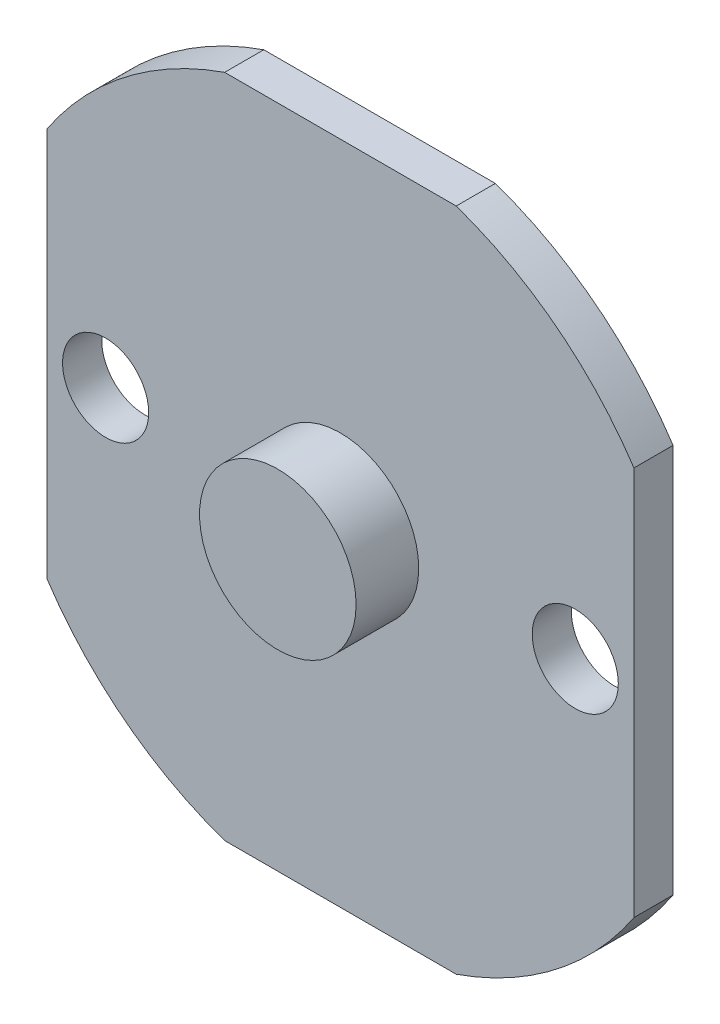
ISO-10303-21;
HEADER;
FILE_DESCRIPTION(('STEP AP214'),'2;1');
FILE_NAME('part.step','',(''),(''),'','','');
FILE_SCHEMA(('AUTOMOTIVE_DESIGN { 1 0 10303 214 1 1 1 1 }'));
ENDSEC;
DATA;
#1=APPLICATION_CONTEXT('core data for automotive mechanical design processes');
#2=APPLICATION_PROTOCOL_DEFINITION('international standard','automotive_design',2000,#1);
#3=PRODUCT_CONTEXT('',#1,'mechanical');
#4=PRODUCT('Part','Part','',(#3));
#5=PRODUCT_RELATED_PRODUCT_CATEGORY('part','',(#4));
#6=PRODUCT_DEFINITION_FORMATION('','',#4);
#7=PRODUCT_DEFINITION_CONTEXT('part definition',#1,'design');
#8=PRODUCT_DEFINITION('design','',#6,#7);
#9=PRODUCT_DEFINITION_SHAPE('','',#8);
#10=(LENGTH_UNIT() NAMED_UNIT(*) SI_UNIT(.MILLI.,.METRE.));
#11=(NAMED_UNIT(*) PLANE_ANGLE_UNIT() SI_UNIT($,.RADIAN.));
#12=(NAMED_UNIT(*) SI_UNIT($,.STERADIAN.) SOLID_ANGLE_UNIT());
#13=UNCERTAINTY_MEASURE_WITH_UNIT(LENGTH_MEASURE(1.E-05),#10,'distance_accuracy_value','');
#14=(GEOMETRIC_REPRESENTATION_CONTEXT(3) GLOBAL_UNCERTAINTY_ASSIGNED_CONTEXT((#13)) GLOBAL_UNIT_ASSIGNED_CONTEXT((#10,
#11,#12)) REPRESENTATION_CONTEXT('',''));
#15=CARTESIAN_POINT('',(0.,0.,0.));
#16=DIRECTION('',(0.,0.,1.));
#17=DIRECTION('',(1.,0.,0.));
#18=AXIS2_PLACEMENT_3D('',#15,#16,#17);
#19=CARTESIAN_POINT('',(0.,0.,1.));
#20=DIRECTION('',(0.,0.,1.));
#21=DIRECTION('',(1.,0.,0.));
#22=AXIS2_PLACEMENT_3D('',#19,#20,#21);
#23=PLANE('',#22);
#24=CARTESIAN_POINT('',(0.,0.,1.));
#25=DIRECTION('',(0.,0.,1.));
#26=DIRECTION('',(1.,0.,0.));
#27=AXIS2_PLACEMENT_3D('',#24,#25,#26);
#28=CIRCLE('',#27,2.);
#29=CARTESIAN_POINT('',(2.,0.,1.));
#30=VERTEX_POINT('',#29);
#31=EDGE_CURVE('E195',#30,#30,#28,.T.);
#32=ORIENTED_EDGE('',*,*,#31,.F.);
#33=EDGE_LOOP('',(#32));
#34=FACE_BOUND('',#33,.T.);
#35=CARTESIAN_POINT('',(6.,0.,1.));
#36=DIRECTION('',(0.,0.,1.));
#37=DIRECTION('',(1.,0.,0.));
#38=AXIS2_PLACEMENT_3D('',#35,#36,#37);
#39=CIRCLE('',#38,1.1);
#40=CARTESIAN_POINT('',(7.1,0.,1.));
#41=VERTEX_POINT('',#40);
#42=EDGE_CURVE('E153',#41,#41,#39,.T.);
#43=ORIENTED_EDGE('',*,*,#42,.F.);
#44=EDGE_LOOP('',(#43));
#45=FACE_BOUND('',#44,.T.);
#46=CARTESIAN_POINT('',(-6.,0.,1.));
#47=DIRECTION('',(0.,0.,1.));
#48=DIRECTION('',(1.,0.,0.));
#49=AXIS2_PLACEMENT_3D('',#46,#47,#48);
#50=CIRCLE('',#49,1.1);
#51=CARTESIAN_POINT('',(-4.9,0.,1.));
#52=VERTEX_POINT('',#51);
#53=EDGE_CURVE('E167',#52,#52,#50,.T.);
#54=ORIENTED_EDGE('',*,*,#53,.F.);
#55=EDGE_LOOP('',(#54));
#56=FACE_BOUND('',#55,.T.);
#57=CARTESIAN_POINT('',(0.,0.,1.));
#58=DIRECTION('',(0.,0.,1.));
#59=DIRECTION('',(1.,0.,0.));
#60=AXIS2_PLACEMENT_3D('',#57,#58,#59);
#61=CIRCLE('',#60,9.);
#62=CARTESIAN_POINT('',(2.95803989154981,-8.5,1.));
#63=VERTEX_POINT('',#62);
#64=CARTESIAN_POINT('',(7.5,-4.9749371855331,1.));
#65=VERTEX_POINT('',#64);
#66=EDGE_CURVE('E133',#63,#65,#61,.T.);
#67=ORIENTED_EDGE('',*,*,#66,.T.);
#68=DIRECTION('',(0.,1.,0.));
#69=VECTOR('',#68,1.);
#70=CARTESIAN_POINT('',(7.5,8.5,1.));
#71=LINE('',#70,#69);
#72=CARTESIAN_POINT('',(7.5,4.9749371855331,1.));
#73=VERTEX_POINT('',#72);
#74=EDGE_CURVE('E115',#65,#73,#71,.T.);
#75=ORIENTED_EDGE('',*,*,#74,.T.);
#76=CARTESIAN_POINT('',(2.9580398915498,8.5,1.));
#77=VERTEX_POINT('',#76);
#78=EDGE_CURVE('E122',#73,#77,#61,.T.);
#79=ORIENTED_EDGE('',*,*,#78,.T.);
#80=DIRECTION('',(-1.,0.,0.));
#81=VECTOR('',#80,1.);
#82=CARTESIAN_POINT('',(-7.5,8.5,1.));
#83=LINE('',#82,#81);
#84=CARTESIAN_POINT('',(-2.9580398915498,8.5,1.));
#85=VERTEX_POINT('',#84);
#86=EDGE_CURVE('E102',#77,#85,#83,.T.);
#87=ORIENTED_EDGE('',*,*,#86,.T.);
#88=CARTESIAN_POINT('',(-7.5,4.9749371855331,1.));
#89=VERTEX_POINT('',#88);
#90=EDGE_CURVE('E131',#85,#89,#61,.T.);
#91=ORIENTED_EDGE('',*,*,#90,.T.);
#92=DIRECTION('',(0.,-1.,0.));
#93=VECTOR('',#92,1.);
#94=CARTESIAN_POINT('',(-7.5,8.5,1.));
#95=LINE('',#94,#93);
#96=CARTESIAN_POINT('',(-7.5,-4.9749371855331,1.));
#97=VERTEX_POINT('',#96);
#98=EDGE_CURVE('E114',#89,#97,#95,.T.);
#99=ORIENTED_EDGE('',*,*,#98,.T.);
#100=CARTESIAN_POINT('',(-2.95803989154981,-8.5,1.));
#101=VERTEX_POINT('',#100);
#102=EDGE_CURVE('E137',#97,#101,#61,.T.);
#103=ORIENTED_EDGE('',*,*,#102,.T.);
#104=DIRECTION('',(1.,0.,0.));
#105=VECTOR('',#104,1.);
#106=CARTESIAN_POINT('',(-7.5,-8.5,1.));
#107=LINE('',#106,#105);
#108=EDGE_CURVE('E186',#101,#63,#107,.T.);
#109=ORIENTED_EDGE('',*,*,#108,.T.);
#110=EDGE_LOOP('',(#67,#75,#79,#87,#91,#99,#103,#109));
#111=FACE_BOUND('',#110,.T.);
#112=ADVANCED_FACE('F38',(#34,#45,#56,#111),#23,.T.);
#113=CARTESIAN_POINT('',(0.,0.,0.));
#114=DIRECTION('',(0.,0.,1.));
#115=DIRECTION('',(1.,0.,0.));
#116=AXIS2_PLACEMENT_3D('',#113,#114,#115);
#117=PLANE('',#116);
#118=CARTESIAN_POINT('',(6.,0.,0.));
#119=DIRECTION('',(0.,0.,1.));
#120=DIRECTION('',(1.,0.,0.));
#121=AXIS2_PLACEMENT_3D('',#118,#119,#120);
#122=CIRCLE('',#121,1.1);
#123=CARTESIAN_POINT('',(7.1,0.,0.));
#124=VERTEX_POINT('',#123);
#125=EDGE_CURVE('E161',#124,#124,#122,.T.);
#126=ORIENTED_EDGE('',*,*,#125,.T.);
#127=EDGE_LOOP('',(#126));
#128=FACE_BOUND('',#127,.T.);
#129=CARTESIAN_POINT('',(-6.,0.,0.));
#130=DIRECTION('',(0.,0.,1.));
#131=DIRECTION('',(1.,0.,0.));
#132=AXIS2_PLACEMENT_3D('',#129,#130,#131);
#133=CIRCLE('',#132,1.1);
#134=CARTESIAN_POINT('',(-4.9,0.,0.));
#135=VERTEX_POINT('',#134);
#136=EDGE_CURVE('E169',#135,#135,#133,.T.);
#137=ORIENTED_EDGE('',*,*,#136,.T.);
#138=EDGE_LOOP('',(#137));
#139=FACE_BOUND('',#138,.T.);
#140=DIRECTION('',(0.,1.,0.));
#141=VECTOR('',#140,1.);
#142=CARTESIAN_POINT('',(7.5,0.,0.));
#143=LINE('',#142,#141);
#144=CARTESIAN_POINT('',(7.5,-4.9749371855331,0.));
#145=VERTEX_POINT('',#144);
#146=CARTESIAN_POINT('',(7.5,4.9749371855331,0.));
#147=VERTEX_POINT('',#146);
#148=EDGE_CURVE('E173',#145,#147,#143,.T.);
#149=ORIENTED_EDGE('',*,*,#148,.F.);
#150=CARTESIAN_POINT('',(0.,0.,0.));
#151=DIRECTION('',(0.,0.,1.));
#152=DIRECTION('',(1.,0.,0.));
#153=AXIS2_PLACEMENT_3D('',#150,#151,#152);
#154=CIRCLE('',#153,9.);
#155=CARTESIAN_POINT('',(2.95803989154981,-8.5,0.));
#156=VERTEX_POINT('',#155);
#157=EDGE_CURVE('E147',#156,#145,#154,.T.);
#158=ORIENTED_EDGE('',*,*,#157,.F.);
#159=DIRECTION('',(1.,0.,0.));
#160=VECTOR('',#159,1.);
#161=CARTESIAN_POINT('',(0.,-8.5,0.));
#162=LINE('',#161,#160);
#163=CARTESIAN_POINT('',(-2.95803989154981,-8.5,0.));
#164=VERTEX_POINT('',#163);
#165=EDGE_CURVE('E54',#164,#156,#162,.T.);
#166=ORIENTED_EDGE('',*,*,#165,.F.);
#167=CARTESIAN_POINT('',(-7.5,-4.9749371855331,0.));
#168=VERTEX_POINT('',#167);
#169=EDGE_CURVE('E150',#168,#164,#154,.T.);
#170=ORIENTED_EDGE('',*,*,#169,.F.);
#171=DIRECTION('',(0.,-1.,0.));
#172=VECTOR('',#171,1.);
#173=CARTESIAN_POINT('',(-7.5,0.,0.));
#174=LINE('',#173,#172);
#175=CARTESIAN_POINT('',(-7.5,4.9749371855331,0.));
#176=VERTEX_POINT('',#175);
#177=EDGE_CURVE('E62',#176,#168,#174,.T.);
#178=ORIENTED_EDGE('',*,*,#177,.F.);
#179=CARTESIAN_POINT('',(-2.9580398915498,8.5,0.));
#180=VERTEX_POINT('',#179);
#181=EDGE_CURVE('E146',#180,#176,#154,.T.);
#182=ORIENTED_EDGE('',*,*,#181,.F.);
#183=DIRECTION('',(-1.,0.,0.));
#184=VECTOR('',#183,1.);
#185=CARTESIAN_POINT('',(0.,8.5,0.));
#186=LINE('',#185,#184);
#187=CARTESIAN_POINT('',(2.9580398915498,8.5,0.));
#188=VERTEX_POINT('',#187);
#189=EDGE_CURVE('E183',#188,#180,#186,.T.);
#190=ORIENTED_EDGE('',*,*,#189,.F.);
#191=EDGE_CURVE('E124',#147,#188,#154,.T.);
#192=ORIENTED_EDGE('',*,*,#191,.F.);
#193=EDGE_LOOP('',(#149,#158,#166,#170,#178,#182,#190,#192));
#194=FACE_BOUND('',#193,.T.);
#195=ADVANCED_FACE('F214',(#128,#139,#194),#117,.F.);
#196=CARTESIAN_POINT('',(0.,0.,1.));
#197=DIRECTION('',(0.,0.,-1.));
#198=DIRECTION('',(-1.,0.,0.));
#199=AXIS2_PLACEMENT_3D('',#196,#197,#198);
#200=CYLINDRICAL_SURFACE('',#199,9.);
#201=DIRECTION('',(0.,0.,-1.));
#202=VECTOR('',#201,1.);
#203=CARTESIAN_POINT('',(7.5,-4.9749371855331,1.));
#204=LINE('',#203,#202);
#205=EDGE_CURVE('E11',#65,#145,#204,.T.);
#206=ORIENTED_EDGE('',*,*,#205,.F.);
#207=ORIENTED_EDGE('',*,*,#66,.F.);
#208=DIRECTION('',(0.,0.,-1.));
#209=VECTOR('',#208,1.);
#210=CARTESIAN_POINT('',(2.95803989154981,-8.5,1.));
#211=LINE('',#210,#209);
#212=EDGE_CURVE('E234',#156,#63,#211,.F.);
#213=ORIENTED_EDGE('',*,*,#212,.F.);
#214=ORIENTED_EDGE('',*,*,#157,.T.);
#215=EDGE_LOOP('',(#206,#207,#213,#214));
#216=FACE_BOUND('',#215,.T.);
#217=ADVANCED_FACE('F40',(#216),#200,.T.);
#218=DIRECTION('',(0.,0.,-1.));
#219=VECTOR('',#218,1.);
#220=CARTESIAN_POINT('',(7.5,4.9749371855331,1.));
#221=LINE('',#220,#219);
#222=EDGE_CURVE('E47',#147,#73,#221,.F.);
#223=ORIENTED_EDGE('',*,*,#222,.F.);
#224=ORIENTED_EDGE('',*,*,#191,.T.);
#225=DIRECTION('',(0.,0.,-1.));
#226=VECTOR('',#225,1.);
#227=CARTESIAN_POINT('',(2.9580398915498,8.5,1.));
#228=LINE('',#227,#226);
#229=EDGE_CURVE('E105',#77,#188,#228,.T.);
#230=ORIENTED_EDGE('',*,*,#229,.F.);
#231=ORIENTED_EDGE('',*,*,#78,.F.);
#232=EDGE_LOOP('',(#223,#224,#230,#231));
#233=FACE_BOUND('',#232,.T.);
#234=ADVANCED_FACE('F121',(#233),#200,.T.);
#235=DIRECTION('',(0.,0.,-1.));
#236=VECTOR('',#235,1.);
#237=CARTESIAN_POINT('',(-2.95803989154981,-8.5,1.));
#238=LINE('',#237,#236);
#239=EDGE_CURVE('E232',#101,#164,#238,.T.);
#240=ORIENTED_EDGE('',*,*,#239,.F.);
#241=ORIENTED_EDGE('',*,*,#102,.F.);
#242=DIRECTION('',(0.,0.,-1.));
#243=VECTOR('',#242,1.);
#244=CARTESIAN_POINT('',(-7.5,-4.9749371855331,1.));
#245=LINE('',#244,#243);
#246=EDGE_CURVE('E126',#168,#97,#245,.F.);
#247=ORIENTED_EDGE('',*,*,#246,.F.);
#248=ORIENTED_EDGE('',*,*,#169,.T.);
#249=EDGE_LOOP('',(#240,#241,#247,#248));
#250=FACE_BOUND('',#249,.T.);
#251=ADVANCED_FACE('F249',(#250),#200,.T.);
#252=DIRECTION('',(0.,0.,-1.));
#253=VECTOR('',#252,1.);
#254=CARTESIAN_POINT('',(-7.5,4.9749371855331,1.));
#255=LINE('',#254,#253);
#256=EDGE_CURVE('E239',#89,#176,#255,.T.);
#257=ORIENTED_EDGE('',*,*,#256,.F.);
#258=ORIENTED_EDGE('',*,*,#90,.F.);
#259=DIRECTION('',(0.,0.,-1.));
#260=VECTOR('',#259,1.);
#261=CARTESIAN_POINT('',(-2.9580398915498,8.5,1.));
#262=LINE('',#261,#260);
#263=EDGE_CURVE('E108',#180,#85,#262,.F.);
#264=ORIENTED_EDGE('',*,*,#263,.F.);
#265=ORIENTED_EDGE('',*,*,#181,.T.);
#266=EDGE_LOOP('',(#257,#258,#264,#265));
#267=FACE_BOUND('',#266,.T.);
#268=ADVANCED_FACE('F253',(#267),#200,.T.);
#269=CARTESIAN_POINT('',(6.,0.,1.));
#270=DIRECTION('',(0.,0.,-1.));
#271=DIRECTION('',(-1.,0.,0.));
#272=AXIS2_PLACEMENT_3D('',#269,#270,#271);
#273=CYLINDRICAL_SURFACE('',#272,1.1);
#274=ORIENTED_EDGE('',*,*,#42,.T.);
#275=EDGE_LOOP('',(#274));
#276=FACE_BOUND('',#275,.T.);
#277=ORIENTED_EDGE('',*,*,#125,.F.);
#278=EDGE_LOOP('',(#277));
#279=FACE_BOUND('',#278,.T.);
#280=ADVANCED_FACE('F222',(#276,#279),#273,.F.);
#281=CARTESIAN_POINT('',(-6.,0.,1.));
#282=DIRECTION('',(0.,0.,-1.));
#283=DIRECTION('',(-1.,0.,0.));
#284=AXIS2_PLACEMENT_3D('',#281,#282,#283);
#285=CYLINDRICAL_SURFACE('',#284,1.1);
#286=ORIENTED_EDGE('',*,*,#53,.T.);
#287=EDGE_LOOP('',(#286));
#288=FACE_BOUND('',#287,.T.);
#289=ORIENTED_EDGE('',*,*,#136,.F.);
#290=EDGE_LOOP('',(#289));
#291=FACE_BOUND('',#290,.T.);
#292=ADVANCED_FACE('F219',(#288,#291),#285,.F.);
#293=CARTESIAN_POINT('',(-7.5,8.5,-1.));
#294=DIRECTION('',(0.,1.,0.));
#295=DIRECTION('',(0.,0.,1.));
#296=AXIS2_PLACEMENT_3D('',#293,#294,#295);
#297=PLANE('',#296);
#298=ORIENTED_EDGE('',*,*,#229,.T.);
#299=ORIENTED_EDGE('',*,*,#189,.T.);
#300=ORIENTED_EDGE('',*,*,#263,.T.);
#301=ORIENTED_EDGE('',*,*,#86,.F.);
#302=EDGE_LOOP('',(#298,#299,#300,#301));
#303=FACE_BOUND('',#302,.T.);
#304=ADVANCED_FACE('F104',(#303),#297,.T.);
#305=CARTESIAN_POINT('',(-7.5,8.5,-1.));
#306=DIRECTION('',(-1.,0.,0.));
#307=DIRECTION('',(0.,0.,1.));
#308=AXIS2_PLACEMENT_3D('',#305,#306,#307);
#309=PLANE('',#308);
#310=ORIENTED_EDGE('',*,*,#256,.T.);
#311=ORIENTED_EDGE('',*,*,#177,.T.);
#312=ORIENTED_EDGE('',*,*,#246,.T.);
#313=ORIENTED_EDGE('',*,*,#98,.F.);
#314=EDGE_LOOP('',(#310,#311,#312,#313));
#315=FACE_BOUND('',#314,.T.);
#316=ADVANCED_FACE('F243',(#315),#309,.T.);
#317=CARTESIAN_POINT('',(-7.5,-8.5,-1.));
#318=DIRECTION('',(0.,-1.,0.));
#319=DIRECTION('',(0.,0.,-1.));
#320=AXIS2_PLACEMENT_3D('',#317,#318,#319);
#321=PLANE('',#320);
#322=ORIENTED_EDGE('',*,*,#239,.T.);
#323=ORIENTED_EDGE('',*,*,#165,.T.);
#324=ORIENTED_EDGE('',*,*,#212,.T.);
#325=ORIENTED_EDGE('',*,*,#108,.F.);
#326=EDGE_LOOP('',(#322,#323,#324,#325));
#327=FACE_BOUND('',#326,.T.);
#328=ADVANCED_FACE('F250',(#327),#321,.T.);
#329=CARTESIAN_POINT('',(7.5,8.5,-1.));
#330=DIRECTION('',(1.,0.,0.));
#331=DIRECTION('',(0.,0.,-1.));
#332=AXIS2_PLACEMENT_3D('',#329,#330,#331);
#333=PLANE('',#332);
#334=ORIENTED_EDGE('',*,*,#205,.T.);
#335=ORIENTED_EDGE('',*,*,#148,.T.);
#336=ORIENTED_EDGE('',*,*,#222,.T.);
#337=ORIENTED_EDGE('',*,*,#74,.F.);
#338=EDGE_LOOP('',(#334,#335,#336,#337));
#339=FACE_BOUND('',#338,.T.);
#340=ADVANCED_FACE('F208',(#339),#333,.T.);
#341=CARTESIAN_POINT('',(0.,0.,2.6));
#342=DIRECTION('',(0.,0.,-1.));
#343=DIRECTION('',(-1.,0.,0.));
#344=AXIS2_PLACEMENT_3D('',#341,#342,#343);
#345=CYLINDRICAL_SURFACE('',#344,2.);
#346=CARTESIAN_POINT('',(0.,0.,2.6));
#347=DIRECTION('',(0.,0.,1.));
#348=DIRECTION('',(1.,0.,0.));
#349=AXIS2_PLACEMENT_3D('',#346,#347,#348);
#350=CIRCLE('',#349,2.);
#351=CARTESIAN_POINT('',(2.,0.,2.6));
#352=VERTEX_POINT('',#351);
#353=EDGE_CURVE('E194',#352,#352,#350,.T.);
#354=ORIENTED_EDGE('',*,*,#353,.F.);
#355=EDGE_LOOP('',(#354));
#356=FACE_BOUND('',#355,.T.);
#357=ORIENTED_EDGE('',*,*,#31,.T.);
#358=EDGE_LOOP('',(#357));
#359=FACE_BOUND('',#358,.T.);
#360=ADVANCED_FACE('F205',(#356,#359),#345,.T.);
#361=CARTESIAN_POINT('',(0.,0.,2.6));
#362=DIRECTION('',(0.,0.,1.));
#363=DIRECTION('',(1.,0.,0.));
#364=AXIS2_PLACEMENT_3D('',#361,#362,#363);
#365=PLANE('',#364);
#366=ORIENTED_EDGE('',*,*,#353,.T.);
#367=EDGE_LOOP('',(#366));
#368=FACE_BOUND('',#367,.T.);
#369=ADVANCED_FACE('F203',(#368),#365,.T.);
#370=CLOSED_SHELL('',(#112,#195,#217,#234,#251,#268,#280,#292,#304,#316,#328,#340,#360,#369));
#371=MANIFOLD_SOLID_BREP('B2',#370);
#372=ADVANCED_BREP_SHAPE_REPRESENTATION('',(#18,#371),#14);
#373=SHAPE_DEFINITION_REPRESENTATION(#9,#372);
ENDSEC;
END-ISO-10303-21;
